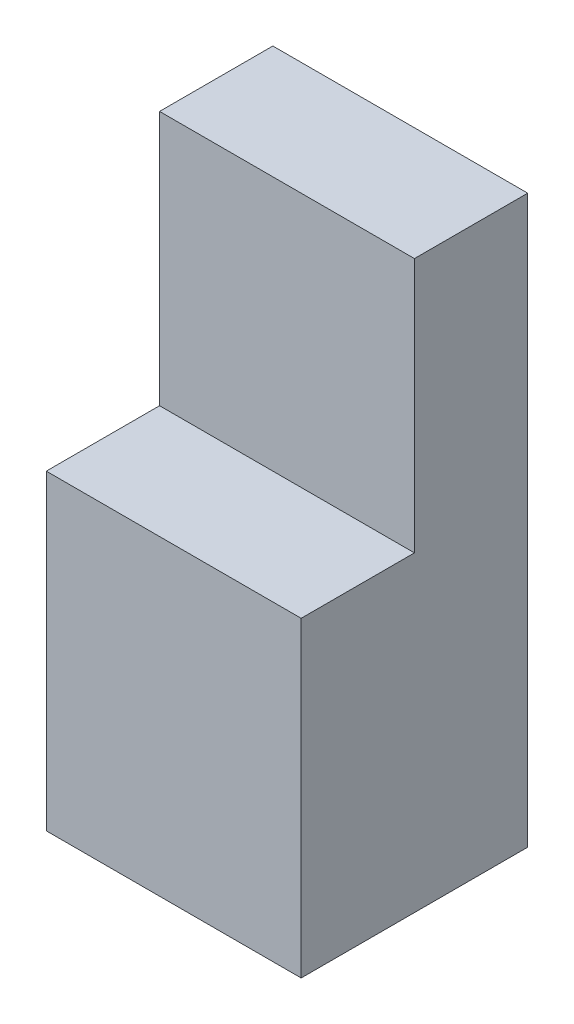
ISO-10303-21;
HEADER;
FILE_DESCRIPTION(('STEP AP214'),'2;1');
FILE_NAME('part.step','',(''),(''),'','','');
FILE_SCHEMA(('AUTOMOTIVE_DESIGN { 1 0 10303 214 1 1 1 1 }'));
ENDSEC;
DATA;
#1=APPLICATION_CONTEXT('core data for automotive mechanical design processes');
#2=APPLICATION_PROTOCOL_DEFINITION('international standard','automotive_design',2000,#1);
#3=PRODUCT_CONTEXT('',#1,'mechanical');
#4=PRODUCT('Part','Part','',(#3));
#5=PRODUCT_RELATED_PRODUCT_CATEGORY('part','',(#4));
#6=PRODUCT_DEFINITION_FORMATION('','',#4);
#7=PRODUCT_DEFINITION_CONTEXT('part definition',#1,'design');
#8=PRODUCT_DEFINITION('design','',#6,#7);
#9=PRODUCT_DEFINITION_SHAPE('','',#8);
#10=(LENGTH_UNIT() NAMED_UNIT(*) SI_UNIT(.MILLI.,.METRE.));
#11=(NAMED_UNIT(*) PLANE_ANGLE_UNIT() SI_UNIT($,.RADIAN.));
#12=(NAMED_UNIT(*) SI_UNIT($,.STERADIAN.) SOLID_ANGLE_UNIT());
#13=UNCERTAINTY_MEASURE_WITH_UNIT(LENGTH_MEASURE(1.E-05),#10,'distance_accuracy_value','');
#14=(GEOMETRIC_REPRESENTATION_CONTEXT(3) GLOBAL_UNCERTAINTY_ASSIGNED_CONTEXT((#13)) GLOBAL_UNIT_ASSIGNED_CONTEXT((#10,
#11,#12)) REPRESENTATION_CONTEXT('',''));
#15=CARTESIAN_POINT('',(0.,0.,0.));
#16=DIRECTION('',(0.,0.,1.));
#17=DIRECTION('',(1.,0.,0.));
#18=AXIS2_PLACEMENT_3D('',#15,#16,#17);
#19=CARTESIAN_POINT('',(-9.,20.,8.));
#20=DIRECTION('',(1.,0.,0.));
#21=DIRECTION('',(0.,1.,0.));
#22=AXIS2_PLACEMENT_3D('',#19,#20,#21);
#23=PLANE('',#22);
#24=DIRECTION('',(0.,-1.,0.));
#25=VECTOR('',#24,1.);
#26=CARTESIAN_POINT('',(-9.,20.,0.));
#27=LINE('',#26,#25);
#28=CARTESIAN_POINT('',(-9.,20.,0.));
#29=VERTEX_POINT('',#28);
#30=CARTESIAN_POINT('',(-9.,-20.,0.));
#31=VERTEX_POINT('',#30);
#32=EDGE_CURVE('E90',#29,#31,#27,.T.);
#33=ORIENTED_EDGE('',*,*,#32,.T.);
#34=DIRECTION('',(0.,0.,-1.));
#35=VECTOR('',#34,1.);
#36=CARTESIAN_POINT('',(-9.,-20.,8.));
#37=LINE('',#36,#35);
#38=CARTESIAN_POINT('',(-9.,-20.,16.));
#39=VERTEX_POINT('',#38);
#40=EDGE_CURVE('E11',#39,#31,#37,.T.);
#41=ORIENTED_EDGE('',*,*,#40,.F.);
#42=DIRECTION('',(0.,-1.,0.));
#43=VECTOR('',#42,1.);
#44=CARTESIAN_POINT('',(-9.,-20.,16.));
#45=LINE('',#44,#43);
#46=CARTESIAN_POINT('',(-9.,2.,16.));
#47=VERTEX_POINT('',#46);
#48=EDGE_CURVE('E127',#47,#39,#45,.T.);
#49=ORIENTED_EDGE('',*,*,#48,.F.);
#50=DIRECTION('',(0.,0.,-1.));
#51=VECTOR('',#50,1.);
#52=CARTESIAN_POINT('',(-9.,2.,16.));
#53=LINE('',#52,#51);
#54=CARTESIAN_POINT('',(-9.,2.,8.));
#55=VERTEX_POINT('',#54);
#56=EDGE_CURVE('E99',#47,#55,#53,.T.);
#57=ORIENTED_EDGE('',*,*,#56,.T.);
#58=DIRECTION('',(0.,-1.,0.));
#59=VECTOR('',#58,1.);
#60=CARTESIAN_POINT('',(-9.,20.,8.));
#61=LINE('',#60,#59);
#62=CARTESIAN_POINT('',(-9.,20.,8.));
#63=VERTEX_POINT('',#62);
#64=EDGE_CURVE('E84',#63,#55,#61,.T.);
#65=ORIENTED_EDGE('',*,*,#64,.F.);
#66=DIRECTION('',(0.,0.,-1.));
#67=VECTOR('',#66,1.);
#68=CARTESIAN_POINT('',(-9.,20.,8.));
#69=LINE('',#68,#67);
#70=EDGE_CURVE('E77',#63,#29,#69,.T.);
#71=ORIENTED_EDGE('',*,*,#70,.T.);
#72=EDGE_LOOP('',(#33,#41,#49,#57,#65,#71));
#73=FACE_BOUND('',#72,.T.);
#74=ADVANCED_FACE('F35',(#73),#23,.F.);
#75=CARTESIAN_POINT('',(-9.,-20.,8.));
#76=DIRECTION('',(0.,1.,0.));
#77=DIRECTION('',(0.,0.,1.));
#78=AXIS2_PLACEMENT_3D('',#75,#76,#77);
#79=PLANE('',#78);
#80=DIRECTION('',(1.,0.,0.));
#81=VECTOR('',#80,1.);
#82=CARTESIAN_POINT('',(-9.,-20.,0.));
#83=LINE('',#82,#81);
#84=CARTESIAN_POINT('',(9.,-20.,0.));
#85=VERTEX_POINT('',#84);
#86=EDGE_CURVE('E94',#31,#85,#83,.T.);
#87=ORIENTED_EDGE('',*,*,#86,.T.);
#88=DIRECTION('',(0.,0.,-1.));
#89=VECTOR('',#88,1.);
#90=CARTESIAN_POINT('',(9.,-20.,8.));
#91=LINE('',#90,#89);
#92=CARTESIAN_POINT('',(9.,-20.,16.));
#93=VERTEX_POINT('',#92);
#94=EDGE_CURVE('E42',#93,#85,#91,.T.);
#95=ORIENTED_EDGE('',*,*,#94,.F.);
#96=DIRECTION('',(1.,0.,0.));
#97=VECTOR('',#96,1.);
#98=CARTESIAN_POINT('',(-9.,-20.,16.));
#99=LINE('',#98,#97);
#100=EDGE_CURVE('E119',#39,#93,#99,.T.);
#101=ORIENTED_EDGE('',*,*,#100,.F.);
#102=ORIENTED_EDGE('',*,*,#40,.T.);
#103=EDGE_LOOP('',(#87,#95,#101,#102));
#104=FACE_BOUND('',#103,.T.);
#105=ADVANCED_FACE('F117',(#104),#79,.F.);
#106=CARTESIAN_POINT('',(9.,20.,8.));
#107=DIRECTION('',(-1.,0.,0.));
#108=DIRECTION('',(0.,0.,1.));
#109=AXIS2_PLACEMENT_3D('',#106,#107,#108);
#110=PLANE('',#109);
#111=DIRECTION('',(0.,1.,0.));
#112=VECTOR('',#111,1.);
#113=CARTESIAN_POINT('',(9.,20.,0.));
#114=LINE('',#113,#112);
#115=CARTESIAN_POINT('',(9.,20.,0.));
#116=VERTEX_POINT('',#115);
#117=EDGE_CURVE('E85',#85,#116,#114,.T.);
#118=ORIENTED_EDGE('',*,*,#117,.T.);
#119=DIRECTION('',(0.,0.,-1.));
#120=VECTOR('',#119,1.);
#121=CARTESIAN_POINT('',(9.,20.,8.));
#122=LINE('',#121,#120);
#123=CARTESIAN_POINT('',(9.,20.,8.));
#124=VERTEX_POINT('',#123);
#125=EDGE_CURVE('E80',#124,#116,#122,.T.);
#126=ORIENTED_EDGE('',*,*,#125,.F.);
#127=DIRECTION('',(0.,1.,0.));
#128=VECTOR('',#127,1.);
#129=CARTESIAN_POINT('',(9.,20.,8.));
#130=LINE('',#129,#128);
#131=CARTESIAN_POINT('',(9.,2.,8.));
#132=VERTEX_POINT('',#131);
#133=EDGE_CURVE('E136',#132,#124,#130,.T.);
#134=ORIENTED_EDGE('',*,*,#133,.F.);
#135=DIRECTION('',(0.,0.,-1.));
#136=VECTOR('',#135,1.);
#137=CARTESIAN_POINT('',(9.,2.,16.));
#138=LINE('',#137,#136);
#139=CARTESIAN_POINT('',(9.,2.,16.));
#140=VERTEX_POINT('',#139);
#141=EDGE_CURVE('E95',#140,#132,#138,.T.);
#142=ORIENTED_EDGE('',*,*,#141,.F.);
#143=DIRECTION('',(0.,1.,0.));
#144=VECTOR('',#143,1.);
#145=CARTESIAN_POINT('',(9.,-20.,16.));
#146=LINE('',#145,#144);
#147=EDGE_CURVE('E113',#93,#140,#146,.T.);
#148=ORIENTED_EDGE('',*,*,#147,.F.);
#149=ORIENTED_EDGE('',*,*,#94,.T.);
#150=EDGE_LOOP('',(#118,#126,#134,#142,#148,#149));
#151=FACE_BOUND('',#150,.T.);
#152=ADVANCED_FACE('F109',(#151),#110,.F.);
#153=CARTESIAN_POINT('',(-9.,20.,8.));
#154=DIRECTION('',(0.,-1.,0.));
#155=DIRECTION('',(0.,0.,-1.));
#156=AXIS2_PLACEMENT_3D('',#153,#154,#155);
#157=PLANE('',#156);
#158=DIRECTION('',(-1.,0.,0.));
#159=VECTOR('',#158,1.);
#160=CARTESIAN_POINT('',(-9.,20.,0.));
#161=LINE('',#160,#159);
#162=EDGE_CURVE('E74',#116,#29,#161,.T.);
#163=ORIENTED_EDGE('',*,*,#162,.T.);
#164=ORIENTED_EDGE('',*,*,#70,.F.);
#165=DIRECTION('',(-1.,0.,0.));
#166=VECTOR('',#165,1.);
#167=CARTESIAN_POINT('',(-9.,20.,8.));
#168=LINE('',#167,#166);
#169=EDGE_CURVE('E55',#124,#63,#168,.T.);
#170=ORIENTED_EDGE('',*,*,#169,.F.);
#171=ORIENTED_EDGE('',*,*,#125,.T.);
#172=EDGE_LOOP('',(#163,#164,#170,#171));
#173=FACE_BOUND('',#172,.T.);
#174=ADVANCED_FACE('F76',(#173),#157,.F.);
#175=CARTESIAN_POINT('',(0.,0.,8.));
#176=DIRECTION('',(0.,0.,1.));
#177=DIRECTION('',(1.,0.,0.));
#178=AXIS2_PLACEMENT_3D('',#175,#176,#177);
#179=PLANE('',#178);
#180=DIRECTION('',(-1.,0.,0.));
#181=VECTOR('',#180,1.);
#182=CARTESIAN_POINT('',(-9.,2.,8.));
#183=LINE('',#182,#181);
#184=EDGE_CURVE('E49',#132,#55,#183,.T.);
#185=ORIENTED_EDGE('',*,*,#184,.F.);
#186=ORIENTED_EDGE('',*,*,#133,.T.);
#187=ORIENTED_EDGE('',*,*,#169,.T.);
#188=ORIENTED_EDGE('',*,*,#64,.T.);
#189=EDGE_LOOP('',(#185,#186,#187,#188));
#190=FACE_BOUND('',#189,.T.);
#191=ADVANCED_FACE('F137',(#190),#179,.T.);
#192=CARTESIAN_POINT('',(0.,0.,0.));
#193=DIRECTION('',(0.,0.,1.));
#194=DIRECTION('',(1.,0.,0.));
#195=AXIS2_PLACEMENT_3D('',#192,#193,#194);
#196=PLANE('',#195);
#197=ORIENTED_EDGE('',*,*,#32,.F.);
#198=ORIENTED_EDGE('',*,*,#162,.F.);
#199=ORIENTED_EDGE('',*,*,#117,.F.);
#200=ORIENTED_EDGE('',*,*,#86,.F.);
#201=EDGE_LOOP('',(#197,#198,#199,#200));
#202=FACE_BOUND('',#201,.T.);
#203=ADVANCED_FACE('F93',(#202),#196,.F.);
#204=CARTESIAN_POINT('',(-9.,2.,16.));
#205=DIRECTION('',(0.,-1.,0.));
#206=DIRECTION('',(0.,0.,-1.));
#207=AXIS2_PLACEMENT_3D('',#204,#205,#206);
#208=PLANE('',#207);
#209=ORIENTED_EDGE('',*,*,#184,.T.);
#210=ORIENTED_EDGE('',*,*,#56,.F.);
#211=DIRECTION('',(-1.,0.,0.));
#212=VECTOR('',#211,1.);
#213=CARTESIAN_POINT('',(-9.,2.,16.));
#214=LINE('',#213,#212);
#215=EDGE_CURVE('E129',#140,#47,#214,.T.);
#216=ORIENTED_EDGE('',*,*,#215,.F.);
#217=ORIENTED_EDGE('',*,*,#141,.T.);
#218=EDGE_LOOP('',(#209,#210,#216,#217));
#219=FACE_BOUND('',#218,.T.);
#220=ADVANCED_FACE('F140',(#219),#208,.F.);
#221=CARTESIAN_POINT('',(0.,0.,16.));
#222=DIRECTION('',(0.,0.,-1.));
#223=DIRECTION('',(-1.,0.,0.));
#224=AXIS2_PLACEMENT_3D('',#221,#222,#223);
#225=PLANE('',#224);
#226=ORIENTED_EDGE('',*,*,#48,.T.);
#227=ORIENTED_EDGE('',*,*,#100,.T.);
#228=ORIENTED_EDGE('',*,*,#147,.T.);
#229=ORIENTED_EDGE('',*,*,#215,.T.);
#230=EDGE_LOOP('',(#226,#227,#228,#229));
#231=FACE_BOUND('',#230,.T.);
#232=ADVANCED_FACE('F124',(#231),#225,.F.);
#233=CLOSED_SHELL('',(#74,#105,#152,#174,#191,#203,#220,#232));
#234=MANIFOLD_SOLID_BREP('B2',#233);
#235=ADVANCED_BREP_SHAPE_REPRESENTATION('',(#18,#234),#14);
#236=SHAPE_DEFINITION_REPRESENTATION(#9,#235);
ENDSEC;
END-ISO-10303-21;
